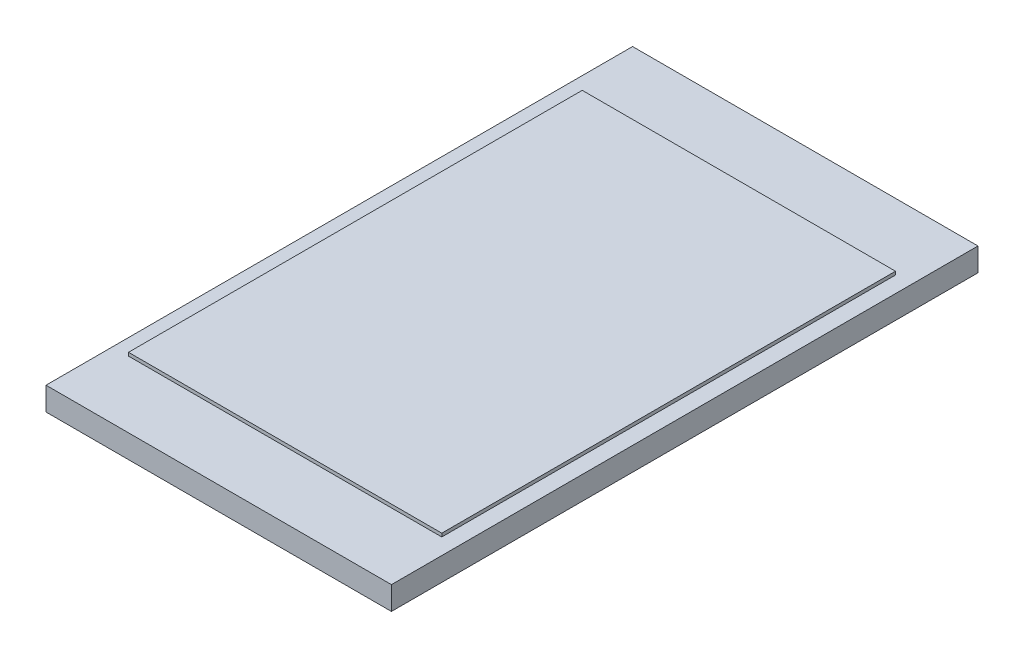
ISO-10303-21;
HEADER;
FILE_DESCRIPTION(('STEP AP214'),'2;1');
FILE_NAME('part.step','',(''),(''),'','','');
FILE_SCHEMA(('AUTOMOTIVE_DESIGN { 1 0 10303 214 1 1 1 1 }'));
ENDSEC;
DATA;
#1=APPLICATION_CONTEXT('core data for automotive mechanical design processes');
#2=APPLICATION_PROTOCOL_DEFINITION('international standard','automotive_design',2000,#1);
#3=PRODUCT_CONTEXT('',#1,'mechanical');
#4=PRODUCT('Part','Part','',(#3));
#5=PRODUCT_RELATED_PRODUCT_CATEGORY('part','',(#4));
#6=PRODUCT_DEFINITION_FORMATION('','',#4);
#7=PRODUCT_DEFINITION_CONTEXT('part definition',#1,'design');
#8=PRODUCT_DEFINITION('design','',#6,#7);
#9=PRODUCT_DEFINITION_SHAPE('','',#8);
#10=(LENGTH_UNIT() NAMED_UNIT(*) SI_UNIT(.MILLI.,.METRE.));
#11=(NAMED_UNIT(*) PLANE_ANGLE_UNIT() SI_UNIT($,.RADIAN.));
#12=(NAMED_UNIT(*) SI_UNIT($,.STERADIAN.) SOLID_ANGLE_UNIT());
#13=UNCERTAINTY_MEASURE_WITH_UNIT(LENGTH_MEASURE(1.E-05),#10,'distance_accuracy_value','');
#14=(GEOMETRIC_REPRESENTATION_CONTEXT(3) GLOBAL_UNCERTAINTY_ASSIGNED_CONTEXT((#13)) GLOBAL_UNIT_ASSIGNED_CONTEXT((#10,
#11,#12)) REPRESENTATION_CONTEXT('',''));
#15=CARTESIAN_POINT('',(0.,0.,0.));
#16=DIRECTION('',(0.,0.,1.));
#17=DIRECTION('',(1.,0.,0.));
#18=AXIS2_PLACEMENT_3D('',#15,#16,#17);
#19=CARTESIAN_POINT('',(0.,8.89,0.));
#20=DIRECTION('',(-1.,0.,0.));
#21=DIRECTION('',(0.,0.,1.));
#22=AXIS2_PLACEMENT_3D('',#19,#20,#21);
#23=PLANE('',#22);
#24=DIRECTION('',(0.,0.,-1.));
#25=VECTOR('',#24,1.);
#26=CARTESIAN_POINT('',(0.,0.,0.));
#27=LINE('',#26,#25);
#28=CARTESIAN_POINT('',(0.,0.,0.));
#29=VERTEX_POINT('',#28);
#30=CARTESIAN_POINT('',(0.,0.,-224.282));
#31=VERTEX_POINT('',#30);
#32=EDGE_CURVE('E121',#29,#31,#27,.T.);
#33=ORIENTED_EDGE('',*,*,#32,.T.);
#34=DIRECTION('',(0.,-1.,0.));
#35=VECTOR('',#34,1.);
#36=CARTESIAN_POINT('',(0.,8.89,-224.282));
#37=LINE('',#36,#35);
#38=CARTESIAN_POINT('',(0.,8.89,-224.282));
#39=VERTEX_POINT('',#38);
#40=EDGE_CURVE('E11',#39,#31,#37,.T.);
#41=ORIENTED_EDGE('',*,*,#40,.F.);
#42=DIRECTION('',(0.,0.,-1.));
#43=VECTOR('',#42,1.);
#44=CARTESIAN_POINT('',(0.,8.89,0.));
#45=LINE('',#44,#43);
#46=CARTESIAN_POINT('',(0.,8.89,0.));
#47=VERTEX_POINT('',#46);
#48=EDGE_CURVE('E130',#47,#39,#45,.T.);
#49=ORIENTED_EDGE('',*,*,#48,.F.);
#50=DIRECTION('',(0.,-1.,0.));
#51=VECTOR('',#50,1.);
#52=CARTESIAN_POINT('',(0.,8.89,0.));
#53=LINE('',#52,#51);
#54=EDGE_CURVE('E139',#47,#29,#53,.T.);
#55=ORIENTED_EDGE('',*,*,#54,.T.);
#56=EDGE_LOOP('',(#33,#41,#49,#55));
#57=FACE_BOUND('',#56,.T.);
#58=ADVANCED_FACE('F37',(#57),#23,.F.);
#59=CARTESIAN_POINT('',(0.,8.89,-224.282));
#60=DIRECTION('',(0.,0.,1.));
#61=DIRECTION('',(1.,0.,0.));
#62=AXIS2_PLACEMENT_3D('',#59,#60,#61);
#63=PLANE('',#62);
#64=DIRECTION('',(-1.,0.,0.));
#65=VECTOR('',#64,1.);
#66=CARTESIAN_POINT('',(0.,0.,-224.282));
#67=LINE('',#66,#65);
#68=CARTESIAN_POINT('',(-132.08,0.,-224.282));
#69=VERTEX_POINT('',#68);
#70=EDGE_CURVE('E124',#31,#69,#67,.T.);
#71=ORIENTED_EDGE('',*,*,#70,.T.);
#72=DIRECTION('',(0.,-1.,0.));
#73=VECTOR('',#72,1.);
#74=CARTESIAN_POINT('',(-132.08,8.89,-224.282));
#75=LINE('',#74,#73);
#76=CARTESIAN_POINT('',(-132.08,8.89,-224.282));
#77=VERTEX_POINT('',#76);
#78=EDGE_CURVE('E44',#77,#69,#75,.T.);
#79=ORIENTED_EDGE('',*,*,#78,.F.);
#80=DIRECTION('',(-1.,0.,0.));
#81=VECTOR('',#80,1.);
#82=CARTESIAN_POINT('',(0.,8.89,-224.282));
#83=LINE('',#82,#81);
#84=EDGE_CURVE('E133',#39,#77,#83,.T.);
#85=ORIENTED_EDGE('',*,*,#84,.F.);
#86=ORIENTED_EDGE('',*,*,#40,.T.);
#87=EDGE_LOOP('',(#71,#79,#85,#86));
#88=FACE_BOUND('',#87,.T.);
#89=ADVANCED_FACE('F170',(#88),#63,.F.);
#90=CARTESIAN_POINT('',(-132.08,8.89,0.));
#91=DIRECTION('',(1.,0.,0.));
#92=DIRECTION('',(0.,0.,-1.));
#93=AXIS2_PLACEMENT_3D('',#90,#91,#92);
#94=PLANE('',#93);
#95=DIRECTION('',(0.,0.,1.));
#96=VECTOR('',#95,1.);
#97=CARTESIAN_POINT('',(-132.08,0.,0.));
#98=LINE('',#97,#96);
#99=CARTESIAN_POINT('',(-132.08,0.,0.));
#100=VERTEX_POINT('',#99);
#101=EDGE_CURVE('E142',#69,#100,#98,.T.);
#102=ORIENTED_EDGE('',*,*,#101,.T.);
#103=DIRECTION('',(0.,-1.,0.));
#104=VECTOR('',#103,1.);
#105=CARTESIAN_POINT('',(-132.08,8.89,0.));
#106=LINE('',#105,#104);
#107=CARTESIAN_POINT('',(-132.08,8.89,0.));
#108=VERTEX_POINT('',#107);
#109=EDGE_CURVE('E147',#108,#100,#106,.T.);
#110=ORIENTED_EDGE('',*,*,#109,.F.);
#111=DIRECTION('',(0.,0.,1.));
#112=VECTOR('',#111,1.);
#113=CARTESIAN_POINT('',(-132.08,8.89,0.));
#114=LINE('',#113,#112);
#115=EDGE_CURVE('E136',#77,#108,#114,.T.);
#116=ORIENTED_EDGE('',*,*,#115,.F.);
#117=ORIENTED_EDGE('',*,*,#78,.T.);
#118=EDGE_LOOP('',(#102,#110,#116,#117));
#119=FACE_BOUND('',#118,.T.);
#120=ADVANCED_FACE('F154',(#119),#94,.F.);
#121=CARTESIAN_POINT('',(0.,8.89,0.));
#122=DIRECTION('',(0.,0.,-1.));
#123=DIRECTION('',(-1.,0.,0.));
#124=AXIS2_PLACEMENT_3D('',#121,#122,#123);
#125=PLANE('',#124);
#126=DIRECTION('',(1.,0.,0.));
#127=VECTOR('',#126,1.);
#128=CARTESIAN_POINT('',(0.,0.,0.));
#129=LINE('',#128,#127);
#130=EDGE_CURVE('E134',#100,#29,#129,.T.);
#131=ORIENTED_EDGE('',*,*,#130,.T.);
#132=ORIENTED_EDGE('',*,*,#54,.F.);
#133=DIRECTION('',(1.,0.,0.));
#134=VECTOR('',#133,1.);
#135=CARTESIAN_POINT('',(0.,8.89,0.));
#136=LINE('',#135,#134);
#137=EDGE_CURVE('E138',#108,#47,#136,.T.);
#138=ORIENTED_EDGE('',*,*,#137,.F.);
#139=ORIENTED_EDGE('',*,*,#109,.T.);
#140=EDGE_LOOP('',(#131,#132,#138,#139));
#141=FACE_BOUND('',#140,.T.);
#142=ADVANCED_FACE('F163',(#141),#125,.F.);
#143=CARTESIAN_POINT('',(0.,8.89,0.));
#144=DIRECTION('',(0.,1.,0.));
#145=DIRECTION('',(0.,0.,1.));
#146=AXIS2_PLACEMENT_3D('',#143,#144,#145);
#147=PLANE('',#146);
#148=DIRECTION('',(0.,0.,1.));
#149=VECTOR('',#148,1.);
#150=CARTESIAN_POINT('',(-125.933797834166,8.89,-198.882));
#151=LINE('',#150,#149);
#152=CARTESIAN_POINT('',(-125.933797834166,8.89,-198.882));
#153=VERTEX_POINT('',#152);
#154=CARTESIAN_POINT('',(-125.933797834166,8.89,-25.4));
#155=VERTEX_POINT('',#154);
#156=EDGE_CURVE('E51',#153,#155,#151,.T.);
#157=ORIENTED_EDGE('',*,*,#156,.F.);
#158=DIRECTION('',(-1.,0.,0.));
#159=VECTOR('',#158,1.);
#160=CARTESIAN_POINT('',(-125.933797834166,8.89,-198.882));
#161=LINE('',#160,#159);
#162=CARTESIAN_POINT('',(-6.14620216583353,8.89,-198.882));
#163=VERTEX_POINT('',#162);
#164=EDGE_CURVE('E55',#163,#153,#161,.T.);
#165=ORIENTED_EDGE('',*,*,#164,.F.);
#166=DIRECTION('',(0.,0.,-1.));
#167=VECTOR('',#166,1.);
#168=CARTESIAN_POINT('',(-6.14620216583353,8.89,-198.882));
#169=LINE('',#168,#167);
#170=CARTESIAN_POINT('',(-6.14620216583353,8.89,-25.4));
#171=VERTEX_POINT('',#170);
#172=EDGE_CURVE('E266',#171,#163,#169,.T.);
#173=ORIENTED_EDGE('',*,*,#172,.F.);
#174=DIRECTION('',(1.,0.,0.));
#175=VECTOR('',#174,1.);
#176=CARTESIAN_POINT('',(-125.933797834166,8.89,-25.4));
#177=LINE('',#176,#175);
#178=EDGE_CURVE('E272',#155,#171,#177,.T.);
#179=ORIENTED_EDGE('',*,*,#178,.F.);
#180=EDGE_LOOP('',(#157,#165,#173,#179));
#181=FACE_BOUND('',#180,.T.);
#182=ORIENTED_EDGE('',*,*,#48,.T.);
#183=ORIENTED_EDGE('',*,*,#84,.T.);
#184=ORIENTED_EDGE('',*,*,#115,.T.);
#185=ORIENTED_EDGE('',*,*,#137,.T.);
#186=EDGE_LOOP('',(#182,#183,#184,#185));
#187=FACE_BOUND('',#186,.T.);
#188=ADVANCED_FACE('F169',(#181,#187),#147,.T.);
#189=CARTESIAN_POINT('',(0.,0.,0.));
#190=DIRECTION('',(0.,1.,0.));
#191=DIRECTION('',(0.,0.,1.));
#192=AXIS2_PLACEMENT_3D('',#189,#190,#191);
#193=PLANE('',#192);
#194=ORIENTED_EDGE('',*,*,#32,.F.);
#195=ORIENTED_EDGE('',*,*,#130,.F.);
#196=ORIENTED_EDGE('',*,*,#101,.F.);
#197=ORIENTED_EDGE('',*,*,#70,.F.);
#198=EDGE_LOOP('',(#194,#195,#196,#197));
#199=FACE_BOUND('',#198,.T.);
#200=ADVANCED_FACE('F160',(#199),#193,.F.);
#201=CARTESIAN_POINT('',(-125.933797834166,10.16,-198.882));
#202=DIRECTION('',(1.,0.,0.));
#203=DIRECTION('',(0.,0.,-1.));
#204=AXIS2_PLACEMENT_3D('',#201,#202,#203);
#205=PLANE('',#204);
#206=ORIENTED_EDGE('',*,*,#156,.T.);
#207=DIRECTION('',(0.,-1.,0.));
#208=VECTOR('',#207,1.);
#209=CARTESIAN_POINT('',(-125.933797834166,10.16,-25.4));
#210=LINE('',#209,#208);
#211=CARTESIAN_POINT('',(-125.933797834166,10.16,-25.4));
#212=VERTEX_POINT('',#211);
#213=EDGE_CURVE('E104',#212,#155,#210,.T.);
#214=ORIENTED_EDGE('',*,*,#213,.F.);
#215=DIRECTION('',(0.,0.,1.));
#216=VECTOR('',#215,1.);
#217=CARTESIAN_POINT('',(-125.933797834166,10.16,-198.882));
#218=LINE('',#217,#216);
#219=CARTESIAN_POINT('',(-125.933797834166,10.16,-198.882));
#220=VERTEX_POINT('',#219);
#221=EDGE_CURVE('E110',#220,#212,#218,.T.);
#222=ORIENTED_EDGE('',*,*,#221,.F.);
#223=DIRECTION('',(0.,-1.,0.));
#224=VECTOR('',#223,1.);
#225=CARTESIAN_POINT('',(-125.933797834166,10.16,-198.882));
#226=LINE('',#225,#224);
#227=EDGE_CURVE('E264',#220,#153,#226,.T.);
#228=ORIENTED_EDGE('',*,*,#227,.T.);
#229=EDGE_LOOP('',(#206,#214,#222,#228));
#230=FACE_BOUND('',#229,.T.);
#231=ADVANCED_FACE('F120',(#230),#205,.F.);
#232=CARTESIAN_POINT('',(-125.933797834166,10.16,-25.4));
#233=DIRECTION('',(0.,0.,-1.));
#234=DIRECTION('',(-1.,0.,0.));
#235=AXIS2_PLACEMENT_3D('',#232,#233,#234);
#236=PLANE('',#235);
#237=ORIENTED_EDGE('',*,*,#178,.T.);
#238=DIRECTION('',(0.,-1.,0.));
#239=VECTOR('',#238,1.);
#240=CARTESIAN_POINT('',(-6.14620216583353,10.16,-25.4));
#241=LINE('',#240,#239);
#242=CARTESIAN_POINT('',(-6.14620216583353,10.16,-25.4));
#243=VERTEX_POINT('',#242);
#244=EDGE_CURVE('E106',#243,#171,#241,.T.);
#245=ORIENTED_EDGE('',*,*,#244,.F.);
#246=DIRECTION('',(1.,0.,0.));
#247=VECTOR('',#246,1.);
#248=CARTESIAN_POINT('',(-125.933797834166,10.16,-25.4));
#249=LINE('',#248,#247);
#250=EDGE_CURVE('E99',#212,#243,#249,.T.);
#251=ORIENTED_EDGE('',*,*,#250,.F.);
#252=ORIENTED_EDGE('',*,*,#213,.T.);
#253=EDGE_LOOP('',(#237,#245,#251,#252));
#254=FACE_BOUND('',#253,.T.);
#255=ADVANCED_FACE('F102',(#254),#236,.F.);
#256=CARTESIAN_POINT('',(-6.14620216583353,10.16,-198.882));
#257=DIRECTION('',(-1.,0.,0.));
#258=DIRECTION('',(0.,0.,1.));
#259=AXIS2_PLACEMENT_3D('',#256,#257,#258);
#260=PLANE('',#259);
#261=ORIENTED_EDGE('',*,*,#172,.T.);
#262=DIRECTION('',(0.,-1.,0.));
#263=VECTOR('',#262,1.);
#264=CARTESIAN_POINT('',(-6.14620216583353,10.16,-198.882));
#265=LINE('',#264,#263);
#266=CARTESIAN_POINT('',(-6.14620216583353,10.16,-198.882));
#267=VERTEX_POINT('',#266);
#268=EDGE_CURVE('E126',#267,#163,#265,.T.);
#269=ORIENTED_EDGE('',*,*,#268,.F.);
#270=DIRECTION('',(0.,0.,-1.));
#271=VECTOR('',#270,1.);
#272=CARTESIAN_POINT('',(-6.14620216583353,10.16,-198.882));
#273=LINE('',#272,#271);
#274=EDGE_CURVE('E109',#243,#267,#273,.T.);
#275=ORIENTED_EDGE('',*,*,#274,.F.);
#276=ORIENTED_EDGE('',*,*,#244,.T.);
#277=EDGE_LOOP('',(#261,#269,#275,#276));
#278=FACE_BOUND('',#277,.T.);
#279=ADVANCED_FACE('F188',(#278),#260,.F.);
#280=CARTESIAN_POINT('',(-125.933797834166,10.16,-198.882));
#281=DIRECTION('',(0.,0.,1.));
#282=DIRECTION('',(1.,0.,0.));
#283=AXIS2_PLACEMENT_3D('',#280,#281,#282);
#284=PLANE('',#283);
#285=ORIENTED_EDGE('',*,*,#164,.T.);
#286=ORIENTED_EDGE('',*,*,#227,.F.);
#287=DIRECTION('',(-1.,0.,0.));
#288=VECTOR('',#287,1.);
#289=CARTESIAN_POINT('',(-125.933797834166,10.16,-198.882));
#290=LINE('',#289,#288);
#291=EDGE_CURVE('E115',#267,#220,#290,.T.);
#292=ORIENTED_EDGE('',*,*,#291,.F.);
#293=ORIENTED_EDGE('',*,*,#268,.T.);
#294=EDGE_LOOP('',(#285,#286,#292,#293));
#295=FACE_BOUND('',#294,.T.);
#296=ADVANCED_FACE('F191',(#295),#284,.F.);
#297=CARTESIAN_POINT('',(0.,10.16,0.));
#298=DIRECTION('',(0.,1.,0.));
#299=DIRECTION('',(0.,0.,1.));
#300=AXIS2_PLACEMENT_3D('',#297,#298,#299);
#301=PLANE('',#300);
#302=ORIENTED_EDGE('',*,*,#221,.T.);
#303=ORIENTED_EDGE('',*,*,#250,.T.);
#304=ORIENTED_EDGE('',*,*,#274,.T.);
#305=ORIENTED_EDGE('',*,*,#291,.T.);
#306=EDGE_LOOP('',(#302,#303,#304,#305));
#307=FACE_BOUND('',#306,.T.);
#308=ADVANCED_FACE('F113',(#307),#301,.T.);
#309=CLOSED_SHELL('',(#58,#89,#120,#142,#188,#200,#231,#255,#279,#296,#308));
#310=MANIFOLD_SOLID_BREP('B2',#309);
#311=ADVANCED_BREP_SHAPE_REPRESENTATION('',(#18,#310),#14);
#312=SHAPE_DEFINITION_REPRESENTATION(#9,#311);
ENDSEC;
END-ISO-10303-21;
